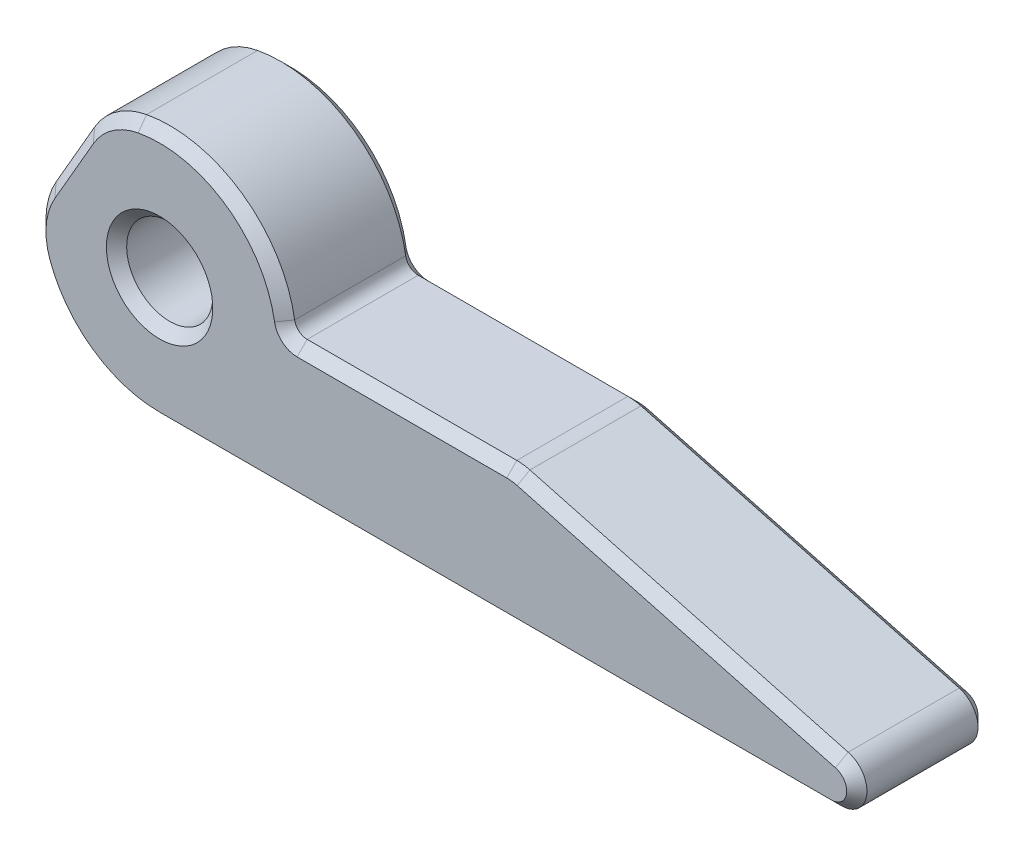
ISO-10303-21;
HEADER;
FILE_DESCRIPTION(('STEP AP214'),'2;1');
FILE_NAME('part.step','',(''),(''),'','','');
FILE_SCHEMA(('AUTOMOTIVE_DESIGN { 1 0 10303 214 1 1 1 1 }'));
ENDSEC;
DATA;
#1=APPLICATION_CONTEXT('core data for automotive mechanical design processes');
#2=APPLICATION_PROTOCOL_DEFINITION('international standard','automotive_design',2000,#1);
#3=PRODUCT_CONTEXT('',#1,'mechanical');
#4=PRODUCT('Part','Part','',(#3));
#5=PRODUCT_RELATED_PRODUCT_CATEGORY('part','',(#4));
#6=PRODUCT_DEFINITION_FORMATION('','',#4);
#7=PRODUCT_DEFINITION_CONTEXT('part definition',#1,'design');
#8=PRODUCT_DEFINITION('design','',#6,#7);
#9=PRODUCT_DEFINITION_SHAPE('','',#8);
#10=(LENGTH_UNIT() NAMED_UNIT(*) SI_UNIT(.MILLI.,.METRE.));
#11=(NAMED_UNIT(*) PLANE_ANGLE_UNIT() SI_UNIT($,.RADIAN.));
#12=(NAMED_UNIT(*) SI_UNIT($,.STERADIAN.) SOLID_ANGLE_UNIT());
#13=UNCERTAINTY_MEASURE_WITH_UNIT(LENGTH_MEASURE(1.E-05),#10,'distance_accuracy_value','');
#14=(GEOMETRIC_REPRESENTATION_CONTEXT(3) GLOBAL_UNCERTAINTY_ASSIGNED_CONTEXT((#13)) GLOBAL_UNIT_ASSIGNED_CONTEXT((#10,
#11,#12)) REPRESENTATION_CONTEXT('',''));
#15=CARTESIAN_POINT('',(0.,0.,0.));
#16=DIRECTION('',(0.,0.,1.));
#17=DIRECTION('',(1.,0.,0.));
#18=AXIS2_PLACEMENT_3D('',#15,#16,#17);
#19=CARTESIAN_POINT('',(0.,-20.6,45.4607145937333));
#20=DIRECTION('',(0.,1.,0.));
#21=DIRECTION('',(-1.,0.,0.));
#22=AXIS2_PLACEMENT_3D('',#19,#20,#21);
#23=PLANE('',#22);
#24=DIRECTION('',(0.,0.,-1.));
#25=VECTOR('',#24,1.);
#26=CARTESIAN_POINT('',(-1.,-20.6,45.4607145937333));
#27=LINE('',#26,#25);
#28=CARTESIAN_POINT('',(-1.,-20.6,11.1433826258471));
#29=VERTEX_POINT('',#28);
#30=CARTESIAN_POINT('',(-1.,-20.6,6.76005707491728));
#31=VERTEX_POINT('',#30);
#32=EDGE_CURVE('E387',#29,#31,#27,.T.);
#33=ORIENTED_EDGE('',*,*,#32,.F.);
#34=DIRECTION('',(-1.,0.,0.));
#35=VECTOR('',#34,1.);
#36=CARTESIAN_POINT('',(0.,-20.6,11.1433826258471));
#37=LINE('',#36,#35);
#38=CARTESIAN_POINT('',(-27.5238826855943,-20.6,11.1433826258471));
#39=VERTEX_POINT('',#38);
#40=EDGE_CURVE('E201',#29,#39,#37,.T.);
#41=ORIENTED_EDGE('',*,*,#40,.T.);
#42=DIRECTION('',(0.,0.,-1.));
#43=VECTOR('',#42,1.);
#44=CARTESIAN_POINT('',(-27.5238826855943,-20.6,45.4607145937333));
#45=LINE('',#44,#43);
#46=CARTESIAN_POINT('',(-27.5238826855943,-20.6,6.76005707491728));
#47=VERTEX_POINT('',#46);
#48=EDGE_CURVE('E318',#39,#47,#45,.T.);
#49=ORIENTED_EDGE('',*,*,#48,.T.);
#50=DIRECTION('',(1.,0.,0.));
#51=VECTOR('',#50,1.);
#52=CARTESIAN_POINT('',(-1.,-20.6,6.76005707491728));
#53=LINE('',#52,#51);
#54=EDGE_CURVE('E223',#47,#31,#53,.T.);
#55=ORIENTED_EDGE('',*,*,#54,.T.);
#56=EDGE_LOOP('',(#33,#41,#49,#55));
#57=FACE_BOUND('',#56,.T.);
#58=ADVANCED_FACE('F43',(#57),#23,.F.);
#59=CARTESIAN_POINT('',(-1.,-19.6,45.4607145937333));
#60=DIRECTION('',(0.,0.,-1.));
#61=DIRECTION('',(-1.,0.,0.));
#62=AXIS2_PLACEMENT_3D('',#59,#60,#61);
#63=CYLINDRICAL_SURFACE('',#62,1.);
#64=DIRECTION('',(0.,0.,-1.));
#65=VECTOR('',#64,1.);
#66=CARTESIAN_POINT('',(-0.741180954897485,-18.6340741737109,45.4607145937333));
#67=LINE('',#66,#65);
#68=CARTESIAN_POINT('',(-0.741180954897485,-18.6340741737109,11.1433826258471));
#69=VERTEX_POINT('',#68);
#70=CARTESIAN_POINT('',(-0.741180954897485,-18.6340741737109,6.76005707491728));
#71=VERTEX_POINT('',#70);
#72=EDGE_CURVE('E443',#69,#71,#67,.T.);
#73=ORIENTED_EDGE('',*,*,#72,.F.);
#74=CARTESIAN_POINT('',(-1.,-19.6,11.1433826258471));
#75=DIRECTION('',(0.,0.,-1.));
#76=DIRECTION('',(-1.,0.,0.));
#77=AXIS2_PLACEMENT_3D('',#74,#75,#76);
#78=CIRCLE('',#77,1.);
#79=EDGE_CURVE('E270',#69,#29,#78,.T.);
#80=ORIENTED_EDGE('',*,*,#79,.T.);
#81=ORIENTED_EDGE('',*,*,#32,.T.);
#82=CARTESIAN_POINT('',(-1.,-19.6,6.76005707491728));
#83=DIRECTION('',(0.,0.,-1.));
#84=DIRECTION('',(-1.,0.,0.));
#85=AXIS2_PLACEMENT_3D('',#82,#83,#84);
#86=CIRCLE('',#85,1.);
#87=EDGE_CURVE('E267',#31,#71,#86,.F.);
#88=ORIENTED_EDGE('',*,*,#87,.T.);
#89=EDGE_LOOP('',(#73,#80,#81,#88));
#90=FACE_BOUND('',#89,.T.);
#91=ADVANCED_FACE('F441',(#90),#63,.T.);
#92=CARTESIAN_POINT('',(-4.70816825300518,-17.5711231307985,45.4607145937333));
#93=DIRECTION('',(-0.258819045102516,-0.96592582628907,0.));
#94=DIRECTION('',(0.96592582628907,-0.258819045102516,0.));
#95=AXIS2_PLACEMENT_3D('',#92,#93,#94);
#96=PLANE('',#95);
#97=DIRECTION('',(0.,0.,-1.));
#98=VECTOR('',#97,1.);
#99=CARTESIAN_POINT('',(-13.3029871531169,-15.2681483474218,45.4607145937333));
#100=LINE('',#99,#98);
#101=CARTESIAN_POINT('',(-13.3029871531169,-15.2681483474218,11.1433826258471));
#102=VERTEX_POINT('',#101);
#103=CARTESIAN_POINT('',(-13.3029871531169,-15.2681483474218,6.76005707491728));
#104=VERTEX_POINT('',#103);
#105=EDGE_CURVE('E445',#102,#104,#100,.T.);
#106=ORIENTED_EDGE('',*,*,#105,.F.);
#107=DIRECTION('',(0.96592582628907,-0.258819045102516,0.));
#108=VECTOR('',#107,1.);
#109=CARTESIAN_POINT('',(-4.70816825300518,-17.5711231307985,11.1433826258471));
#110=LINE('',#109,#108);
#111=EDGE_CURVE('E265',#102,#69,#110,.T.);
#112=ORIENTED_EDGE('',*,*,#111,.T.);
#113=ORIENTED_EDGE('',*,*,#72,.T.);
#114=DIRECTION('',(-0.96592582628907,0.258819045102516,0.));
#115=VECTOR('',#114,1.);
#116=CARTESIAN_POINT('',(-13.3029871531169,-15.2681483474218,6.76005707491728));
#117=LINE('',#116,#115);
#118=EDGE_CURVE('E263',#71,#104,#117,.T.);
#119=ORIENTED_EDGE('',*,*,#118,.T.);
#120=EDGE_LOOP('',(#106,#112,#113,#119));
#121=FACE_BOUND('',#120,.T.);
#122=ADVANCED_FACE('F516',(#121),#96,.F.);
#123=CARTESIAN_POINT('',(-13.8206252433219,-17.2,45.4607145937333));
#124=DIRECTION('',(0.,0.,-1.));
#125=DIRECTION('',(-1.,0.,0.));
#126=AXIS2_PLACEMENT_3D('',#123,#124,#125);
#127=CYLINDRICAL_SURFACE('',#126,2.);
#128=DIRECTION('',(0.,0.,-1.));
#129=VECTOR('',#128,1.);
#130=CARTESIAN_POINT('',(-13.8206252433219,-15.2,45.4607145937333));
#131=LINE('',#130,#129);
#132=CARTESIAN_POINT('',(-13.8206252433219,-15.2,11.1433826258471));
#133=VERTEX_POINT('',#132);
#134=CARTESIAN_POINT('',(-13.8206252433219,-15.2,6.76005707491728));
#135=VERTEX_POINT('',#134);
#136=EDGE_CURVE('E378',#133,#135,#131,.T.);
#137=ORIENTED_EDGE('',*,*,#136,.F.);
#138=CARTESIAN_POINT('',(-13.8206252433219,-17.2,11.1433826258471));
#139=DIRECTION('',(0.,0.,-1.));
#140=DIRECTION('',(-1.,0.,0.));
#141=AXIS2_PLACEMENT_3D('',#138,#139,#140);
#142=CIRCLE('',#141,2.);
#143=EDGE_CURVE('E261',#133,#102,#142,.T.);
#144=ORIENTED_EDGE('',*,*,#143,.T.);
#145=ORIENTED_EDGE('',*,*,#105,.T.);
#146=CARTESIAN_POINT('',(-13.8206252433219,-17.2,6.76005707491728));
#147=DIRECTION('',(0.,0.,-1.));
#148=DIRECTION('',(-1.,0.,0.));
#149=AXIS2_PLACEMENT_3D('',#146,#147,#148);
#150=CIRCLE('',#149,2.);
#151=EDGE_CURVE('E259',#104,#135,#150,.F.);
#152=ORIENTED_EDGE('',*,*,#151,.T.);
#153=EDGE_LOOP('',(#137,#144,#145,#152));
#154=FACE_BOUND('',#153,.T.);
#155=ADVANCED_FACE('F514',(#154),#127,.T.);
#156=CARTESIAN_POINT('',(-3.02407852323237E-13,-15.2000000000003,45.4607145937333));
#157=DIRECTION('',(0.,-1.,0.));
#158=DIRECTION('',(1.,0.,0.));
#159=AXIS2_PLACEMENT_3D('',#156,#157,#158);
#160=PLANE('',#159);
#161=DIRECTION('',(0.,0.,-1.));
#162=VECTOR('',#161,1.);
#163=CARTESIAN_POINT('',(-22.0980186990941,-15.1999999999998,45.4607145937333));
#164=LINE('',#163,#162);
#165=CARTESIAN_POINT('',(-22.0980186990941,-15.1999999999998,6.76005707491728));
#166=VERTEX_POINT('',#165);
#167=CARTESIAN_POINT('',(-22.0980186990941,-15.1999999999998,11.1433826258471));
#168=VERTEX_POINT('',#167);
#169=EDGE_CURVE('E390',#166,#168,#164,.F.);
#170=ORIENTED_EDGE('',*,*,#169,.T.);
#171=DIRECTION('',(1.,0.,0.));
#172=VECTOR('',#171,1.);
#173=CARTESIAN_POINT('',(-3.02407852323237E-13,-15.2000000000003,11.1433826258471));
#174=LINE('',#173,#172);
#175=EDGE_CURVE('E257',#168,#133,#174,.T.);
#176=ORIENTED_EDGE('',*,*,#175,.T.);
#177=ORIENTED_EDGE('',*,*,#136,.T.);
#178=DIRECTION('',(-1.,0.,0.));
#179=VECTOR('',#178,1.);
#180=CARTESIAN_POINT('',(-22.0980186990941,-15.1999999999998,6.76005707491728));
#181=LINE('',#180,#179);
#182=EDGE_CURVE('E255',#135,#166,#181,.T.);
#183=ORIENTED_EDGE('',*,*,#182,.T.);
#184=EDGE_LOOP('',(#170,#176,#177,#183));
#185=FACE_BOUND('',#184,.T.);
#186=ADVANCED_FACE('F453',(#185),#160,.F.);
#187=CARTESIAN_POINT('',(-27.5238826855943,-15.6,45.4607145937333));
#188=DIRECTION('',(0.,0.,-1.));
#189=DIRECTION('',(-1.,0.,0.));
#190=AXIS2_PLACEMENT_3D('',#187,#188,#189);
#191=CYLINDRICAL_SURFACE('',#190,4.99999999999998);
#192=DIRECTION('',(0.,0.,-1.));
#193=VECTOR('',#192,1.);
#194=CARTESIAN_POINT('',(-28.4386297286974,-10.684388354728,45.4607145937333));
#195=LINE('',#194,#193);
#196=CARTESIAN_POINT('',(-28.4386297286974,-10.684388354728,11.1433826258471));
#197=VERTEX_POINT('',#196);
#198=CARTESIAN_POINT('',(-28.4386297286974,-10.684388354728,6.76005707491728));
#199=VERTEX_POINT('',#198);
#200=EDGE_CURVE('E368',#197,#199,#195,.T.);
#201=ORIENTED_EDGE('',*,*,#200,.F.);
#202=CARTESIAN_POINT('',(-27.5238826855943,-15.6,11.1433826258471));
#203=DIRECTION('',(0.,0.,-1.));
#204=DIRECTION('',(-1.,0.,0.));
#205=AXIS2_PLACEMENT_3D('',#202,#203,#204);
#206=CIRCLE('',#205,4.99999999999998);
#207=CARTESIAN_POINT('',(-22.5912790615032,-14.781818181818,11.1433826258471));
#208=VERTEX_POINT('',#207);
#209=EDGE_CURVE('E249',#197,#208,#206,.T.);
#210=ORIENTED_EDGE('',*,*,#209,.T.);
#211=DIRECTION('',(0.,0.,-1.));
#212=VECTOR('',#211,1.);
#213=CARTESIAN_POINT('',(-22.5912790615032,-14.781818181818,45.4607145937333));
#214=LINE('',#213,#212);
#215=CARTESIAN_POINT('',(-22.5912790615032,-14.781818181818,6.76005707491728));
#216=VERTEX_POINT('',#215);
#217=EDGE_CURVE('E384',#208,#216,#214,.T.);
#218=ORIENTED_EDGE('',*,*,#217,.T.);
#219=CARTESIAN_POINT('',(-27.5238826855943,-15.6,6.76005707491728));
#220=DIRECTION('',(0.,0.,-1.));
#221=DIRECTION('',(-1.,0.,0.));
#222=AXIS2_PLACEMENT_3D('',#219,#220,#221);
#223=CIRCLE('',#222,4.99999999999998);
#224=EDGE_CURVE('E247',#216,#199,#223,.F.);
#225=ORIENTED_EDGE('',*,*,#224,.T.);
#226=EDGE_LOOP('',(#201,#210,#218,#225));
#227=FACE_BOUND('',#226,.T.);
#228=ADVANCED_FACE('F489',(#227),#191,.T.);
#229=CARTESIAN_POINT('',(-27.8897815028355,-13.6337553418912,45.4607145937333));
#230=DIRECTION('',(0.,0.,-1.));
#231=DIRECTION('',(-1.,0.,0.));
#232=AXIS2_PLACEMENT_3D('',#229,#230,#231);
#233=CYLINDRICAL_SURFACE('',#232,3.00000000000002);
#234=DIRECTION('',(0.,0.,-1.));
#235=VECTOR('',#234,1.);
#236=CARTESIAN_POINT('',(-30.4878577141889,-12.1337553418912,45.4607145937333));
#237=LINE('',#236,#235);
#238=CARTESIAN_POINT('',(-30.4878577141889,-12.1337553418912,11.1433826258471));
#239=VERTEX_POINT('',#238);
#240=CARTESIAN_POINT('',(-30.4878577141889,-12.1337553418912,6.76005707491728));
#241=VERTEX_POINT('',#240);
#242=EDGE_CURVE('E365',#239,#241,#237,.T.);
#243=ORIENTED_EDGE('',*,*,#242,.F.);
#244=CARTESIAN_POINT('',(-27.8897815028355,-13.6337553418912,11.1433826258471));
#245=DIRECTION('',(0.,0.,-1.));
#246=DIRECTION('',(-1.,0.,0.));
#247=AXIS2_PLACEMENT_3D('',#244,#245,#246);
#248=CIRCLE('',#247,3.00000000000002);
#249=EDGE_CURVE('E245',#239,#197,#248,.T.);
#250=ORIENTED_EDGE('',*,*,#249,.T.);
#251=ORIENTED_EDGE('',*,*,#200,.T.);
#252=CARTESIAN_POINT('',(-27.8897815028355,-13.6337553418912,6.76005707491728));
#253=DIRECTION('',(0.,0.,-1.));
#254=DIRECTION('',(-1.,0.,0.));
#255=AXIS2_PLACEMENT_3D('',#252,#253,#254);
#256=CIRCLE('',#255,3.00000000000002);
#257=EDGE_CURVE('E243',#199,#241,#256,.F.);
#258=ORIENTED_EDGE('',*,*,#257,.T.);
#259=EDGE_LOOP('',(#243,#250,#251,#258));
#260=FACE_BOUND('',#259,.T.);
#261=ADVANCED_FACE('F364',(#260),#233,.T.);
#262=CARTESIAN_POINT('',(-17.6118231009505,10.1681908082536,45.4607145937333));
#263=DIRECTION('',(0.866025403784444,-0.499999999999991,0.));
#264=DIRECTION('',(0.499999999999991,0.866025403784444,0.));
#265=AXIS2_PLACEMENT_3D('',#262,#263,#264);
#266=PLANE('',#265);
#267=DIRECTION('',(0.,0.,-1.));
#268=VECTOR('',#267,1.);
#269=CARTESIAN_POINT('',(-32.0077261295459,-14.7662446581089,45.4607145937333));
#270=LINE('',#269,#268);
#271=CARTESIAN_POINT('',(-32.0077261295459,-14.7662446581089,11.1433826258471));
#272=VERTEX_POINT('',#271);
#273=CARTESIAN_POINT('',(-32.0077261295459,-14.7662446581089,6.76005707491728));
#274=VERTEX_POINT('',#273);
#275=EDGE_CURVE('E374',#272,#274,#270,.T.);
#276=ORIENTED_EDGE('',*,*,#275,.F.);
#277=DIRECTION('',(0.499999999999991,0.866025403784444,0.));
#278=VECTOR('',#277,1.);
#279=CARTESIAN_POINT('',(-17.6118231009505,10.1681908082536,11.1433826258471));
#280=LINE('',#279,#278);
#281=EDGE_CURVE('E241',#272,#239,#280,.T.);
#282=ORIENTED_EDGE('',*,*,#281,.T.);
#283=ORIENTED_EDGE('',*,*,#242,.T.);
#284=DIRECTION('',(-0.499999999999991,-0.866025403784444,0.));
#285=VECTOR('',#284,1.);
#286=CARTESIAN_POINT('',(-32.0077261295459,-14.7662446581089,6.76005707491728));
#287=LINE('',#286,#285);
#288=EDGE_CURVE('E239',#241,#274,#287,.T.);
#289=ORIENTED_EDGE('',*,*,#288,.T.);
#290=EDGE_LOOP('',(#276,#282,#283,#289));
#291=FACE_BOUND('',#290,.T.);
#292=ADVANCED_FACE('F371',(#291),#266,.F.);
#293=CARTESIAN_POINT('',(-29.4096499181926,-16.2662446581088,45.4607145937333));
#294=DIRECTION('',(0.,0.,-1.));
#295=DIRECTION('',(-1.,0.,0.));
#296=AXIS2_PLACEMENT_3D('',#293,#294,#295);
#297=CYLINDRICAL_SURFACE('',#296,3.);
#298=DIRECTION('',(0.,0.,-1.));
#299=VECTOR('',#298,1.);
#300=CARTESIAN_POINT('',(-32.23830076709,-17.2656116452721,45.4607145937333));
#301=LINE('',#300,#299);
#302=CARTESIAN_POINT('',(-32.23830076709,-17.2656116452721,11.1433826258471));
#303=VERTEX_POINT('',#302);
#304=CARTESIAN_POINT('',(-32.23830076709,-17.2656116452721,6.76005707491728));
#305=VERTEX_POINT('',#304);
#306=EDGE_CURVE('E376',#303,#305,#301,.T.);
#307=ORIENTED_EDGE('',*,*,#306,.F.);
#308=CARTESIAN_POINT('',(-29.4096499181926,-16.2662446581088,11.1433826258471));
#309=DIRECTION('',(0.,0.,-1.));
#310=DIRECTION('',(-1.,0.,0.));
#311=AXIS2_PLACEMENT_3D('',#308,#309,#310);
#312=CIRCLE('',#311,3.);
#313=EDGE_CURVE('E237',#303,#272,#312,.T.);
#314=ORIENTED_EDGE('',*,*,#313,.T.);
#315=ORIENTED_EDGE('',*,*,#275,.T.);
#316=CARTESIAN_POINT('',(-29.4096499181926,-16.2662446581088,6.76005707491728));
#317=DIRECTION('',(0.,0.,-1.));
#318=DIRECTION('',(-1.,0.,0.));
#319=AXIS2_PLACEMENT_3D('',#316,#317,#318);
#320=CIRCLE('',#319,3.);
#321=EDGE_CURVE('E235',#274,#305,#320,.F.);
#322=ORIENTED_EDGE('',*,*,#321,.T.);
#323=EDGE_LOOP('',(#307,#314,#315,#322));
#324=FACE_BOUND('',#323,.T.);
#325=ADVANCED_FACE('F768',(#324),#297,.T.);
#326=CARTESIAN_POINT('',(-27.5238826855943,-15.6,45.4607145937333));
#327=DIRECTION('',(0.,0.,-1.));
#328=DIRECTION('',(-1.,0.,0.));
#329=AXIS2_PLACEMENT_3D('',#326,#327,#328);
#330=CYLINDRICAL_SURFACE('',#329,1.70000000000002);
#331=CARTESIAN_POINT('',(-27.5238826855943,-15.6,11.1433826258471));
#332=DIRECTION('',(0.,0.,-1.));
#333=DIRECTION('',(-1.,0.,0.));
#334=AXIS2_PLACEMENT_3D('',#331,#332,#333);
#335=CIRCLE('',#334,1.70000000000002);
#336=CARTESIAN_POINT('',(-29.2238826855943,-15.6,11.1433826258471));
#337=VERTEX_POINT('',#336);
#338=EDGE_CURVE('E215',#337,#337,#335,.F.);
#339=ORIENTED_EDGE('',*,*,#338,.T.);
#340=EDGE_LOOP('',(#339));
#341=FACE_BOUND('',#340,.T.);
#342=CARTESIAN_POINT('',(-27.5238826855943,-15.6,6.76005707491728));
#343=DIRECTION('',(0.,0.,-1.));
#344=DIRECTION('',(-1.,0.,0.));
#345=AXIS2_PLACEMENT_3D('',#342,#343,#344);
#346=CIRCLE('',#345,1.70000000000002);
#347=CARTESIAN_POINT('',(-29.2238826855943,-15.6,6.76005707491728));
#348=VERTEX_POINT('',#347);
#349=EDGE_CURVE('E393',#348,#348,#346,.T.);
#350=ORIENTED_EDGE('',*,*,#349,.T.);
#351=EDGE_LOOP('',(#350));
#352=FACE_BOUND('',#351,.T.);
#353=ADVANCED_FACE('F759',(#341,#352),#330,.F.);
#354=ORIENTED_EDGE('',*,*,#48,.F.);
#355=CARTESIAN_POINT('',(-27.5238826855943,-15.6,11.1433826258471));
#356=DIRECTION('',(0.,0.,-1.));
#357=DIRECTION('',(-1.,0.,0.));
#358=AXIS2_PLACEMENT_3D('',#355,#356,#357);
#359=CIRCLE('',#358,4.99999999999998);
#360=EDGE_CURVE('E233',#39,#303,#359,.T.);
#361=ORIENTED_EDGE('',*,*,#360,.T.);
#362=ORIENTED_EDGE('',*,*,#306,.T.);
#363=CARTESIAN_POINT('',(-27.5238826855943,-15.6,6.76005707491728));
#364=DIRECTION('',(0.,0.,-1.));
#365=DIRECTION('',(-1.,0.,0.));
#366=AXIS2_PLACEMENT_3D('',#363,#364,#365);
#367=CIRCLE('',#366,4.99999999999998);
#368=EDGE_CURVE('E231',#305,#47,#367,.F.);
#369=ORIENTED_EDGE('',*,*,#368,.T.);
#370=EDGE_LOOP('',(#354,#361,#362,#369));
#371=FACE_BOUND('',#370,.T.);
#372=ADVANCED_FACE('F427',(#371),#191,.T.);
#373=CARTESIAN_POINT('',(0.,0.,6.36005707491728));
#374=DIRECTION('',(0.,0.,-1.));
#375=DIRECTION('',(-1.,0.,0.));
#376=AXIS2_PLACEMENT_3D('',#373,#374,#375);
#377=PLANE('',#376);
#378=DIRECTION('',(0.96592582628907,-0.258819045102516,0.));
#379=VECTOR('',#378,1.);
#380=CARTESIAN_POINT('',(-0.844708572938492,-19.0204445042266,6.36005707491728));
#381=LINE('',#380,#379);
#382=CARTESIAN_POINT('',(-13.4065147711579,-15.6545186779375,6.36005707491728));
#383=VERTEX_POINT('',#382);
#384=CARTESIAN_POINT('',(-0.844708572938491,-19.0204445042266,6.36005707491728));
#385=VERTEX_POINT('',#384);
#386=EDGE_CURVE('E53',#383,#385,#381,.T.);
#387=ORIENTED_EDGE('',*,*,#386,.T.);
#388=CARTESIAN_POINT('',(-1.,-19.6,6.36005707491728));
#389=DIRECTION('',(0.,0.,-1.));
#390=DIRECTION('',(-1.,0.,0.));
#391=AXIS2_PLACEMENT_3D('',#388,#389,#390);
#392=CIRCLE('',#391,0.6);
#393=CARTESIAN_POINT('',(-1.,-20.2,6.36005707491728));
#394=VERTEX_POINT('',#393);
#395=EDGE_CURVE('E11',#385,#394,#392,.T.);
#396=ORIENTED_EDGE('',*,*,#395,.T.);
#397=DIRECTION('',(-1.,0.,0.));
#398=VECTOR('',#397,1.);
#399=CARTESIAN_POINT('',(-27.5238826855943,-20.2,6.36005707491728));
#400=LINE('',#399,#398);
#401=CARTESIAN_POINT('',(-27.5238826855943,-20.2,6.36005707491728));
#402=VERTEX_POINT('',#401);
#403=EDGE_CURVE('E275',#394,#402,#400,.T.);
#404=ORIENTED_EDGE('',*,*,#403,.T.);
#405=CARTESIAN_POINT('',(-27.5238826855943,-15.6,6.36005707491728));
#406=DIRECTION('',(0.,0.,-1.));
#407=DIRECTION('',(-1.,0.,0.));
#408=AXIS2_PLACEMENT_3D('',#405,#406,#407);
#409=CIRCLE('',#408,4.59999999999997);
#410=CARTESIAN_POINT('',(-31.8611473205703,-17.1323627136504,6.36005707491728));
#411=VERTEX_POINT('',#410);
#412=EDGE_CURVE('E277',#402,#411,#409,.T.);
#413=ORIENTED_EDGE('',*,*,#412,.T.);
#414=CARTESIAN_POINT('',(-29.4096499181926,-16.2662446581088,6.36005707491728));
#415=DIRECTION('',(0.,0.,-1.));
#416=DIRECTION('',(-1.,0.,0.));
#417=AXIS2_PLACEMENT_3D('',#414,#415,#416);
#418=CIRCLE('',#417,2.6);
#419=CARTESIAN_POINT('',(-31.6613159680321,-14.9662446581089,6.36005707491728));
#420=VERTEX_POINT('',#419);
#421=EDGE_CURVE('E279',#411,#420,#418,.T.);
#422=ORIENTED_EDGE('',*,*,#421,.T.);
#423=DIRECTION('',(0.499999999999991,0.866025403784444,0.));
#424=VECTOR('',#423,1.);
#425=CARTESIAN_POINT('',(-30.1414475526751,-12.3337553418912,6.36005707491728));
#426=LINE('',#425,#424);
#427=CARTESIAN_POINT('',(-30.1414475526751,-12.3337553418912,6.36005707491728));
#428=VERTEX_POINT('',#427);
#429=EDGE_CURVE('E281',#420,#428,#426,.T.);
#430=ORIENTED_EDGE('',*,*,#429,.T.);
#431=CARTESIAN_POINT('',(-27.8897815028355,-13.6337553418912,6.36005707491728));
#432=DIRECTION('',(0.,0.,-1.));
#433=DIRECTION('',(-1.,0.,0.));
#434=AXIS2_PLACEMENT_3D('',#431,#432,#433);
#435=CIRCLE('',#434,2.60000000000002);
#436=CARTESIAN_POINT('',(-28.3654499652491,-11.0776372863497,6.36005707491728));
#437=VERTEX_POINT('',#436);
#438=EDGE_CURVE('E283',#428,#437,#435,.T.);
#439=ORIENTED_EDGE('',*,*,#438,.T.);
#440=CARTESIAN_POINT('',(-27.5238826855943,-15.6,6.36005707491728));
#441=DIRECTION('',(0.,0.,-1.));
#442=DIRECTION('',(-1.,0.,0.));
#443=AXIS2_PLACEMENT_3D('',#440,#441,#442);
#444=CIRCLE('',#443,4.59999999999997);
#445=CARTESIAN_POINT('',(-22.9858873514305,-14.8472727272726,6.36005707491728));
#446=VERTEX_POINT('',#445);
#447=EDGE_CURVE('E285',#437,#446,#444,.T.);
#448=ORIENTED_EDGE('',*,*,#447,.T.);
#449=CARTESIAN_POINT('',(-22.0980186990941,-14.6999999999998,6.36005707491728));
#450=DIRECTION('',(0.,0.,-1.));
#451=DIRECTION('',(-1.,0.,0.));
#452=AXIS2_PLACEMENT_3D('',#449,#450,#451);
#453=CIRCLE('',#452,0.900000000000003);
#454=CARTESIAN_POINT('',(-22.0980186990941,-15.5999999999998,6.36005707491728));
#455=VERTEX_POINT('',#454);
#456=EDGE_CURVE('E287',#446,#455,#453,.F.);
#457=ORIENTED_EDGE('',*,*,#456,.T.);
#458=DIRECTION('',(1.,0.,0.));
#459=VECTOR('',#458,1.);
#460=CARTESIAN_POINT('',(-13.8206252433219,-15.6,6.36005707491728));
#461=LINE('',#460,#459);
#462=CARTESIAN_POINT('',(-13.8206252433219,-15.6,6.36005707491728));
#463=VERTEX_POINT('',#462);
#464=EDGE_CURVE('E289',#455,#463,#461,.T.);
#465=ORIENTED_EDGE('',*,*,#464,.T.);
#466=CARTESIAN_POINT('',(-13.8206252433219,-17.2,6.36005707491728));
#467=DIRECTION('',(0.,0.,-1.));
#468=DIRECTION('',(-1.,0.,0.));
#469=AXIS2_PLACEMENT_3D('',#466,#467,#468);
#470=CIRCLE('',#469,1.59999999999999);
#471=EDGE_CURVE('E64',#463,#383,#470,.T.);
#472=ORIENTED_EDGE('',*,*,#471,.T.);
#473=EDGE_LOOP('',(#387,#396,#404,#413,#422,#430,#439,#448,#457,#465,#472));
#474=FACE_BOUND('',#473,.T.);
#475=CARTESIAN_POINT('',(-27.5238826855943,-15.6,6.36005707491728));
#476=DIRECTION('',(0.,0.,-1.));
#477=DIRECTION('',(-1.,0.,0.));
#478=AXIS2_PLACEMENT_3D('',#475,#476,#477);
#479=CIRCLE('',#478,2.10000000000002);
#480=CARTESIAN_POINT('',(-29.6238826855943,-15.6,6.36005707491728));
#481=VERTEX_POINT('',#480);
#482=EDGE_CURVE('E272',#481,#481,#479,.F.);
#483=ORIENTED_EDGE('',*,*,#482,.T.);
#484=EDGE_LOOP('',(#483));
#485=FACE_BOUND('',#484,.T.);
#486=ADVANCED_FACE('F472',(#474,#485),#377,.T.);
#487=CARTESIAN_POINT('',(0.,0.,11.5433826258471));
#488=DIRECTION('',(0.,0.,-1.));
#489=DIRECTION('',(-1.,0.,0.));
#490=AXIS2_PLACEMENT_3D('',#487,#488,#489);
#491=PLANE('',#490);
#492=CARTESIAN_POINT('',(-27.5238826855943,-15.6,11.5433826258471));
#493=DIRECTION('',(0.,0.,-1.));
#494=DIRECTION('',(-1.,0.,0.));
#495=AXIS2_PLACEMENT_3D('',#492,#493,#494);
#496=CIRCLE('',#495,2.10000000000003);
#497=CARTESIAN_POINT('',(-29.6238826855943,-15.6,11.5433826258471));
#498=VERTEX_POINT('',#497);
#499=EDGE_CURVE('E220',#498,#498,#496,.T.);
#500=ORIENTED_EDGE('',*,*,#499,.T.);
#501=EDGE_LOOP('',(#500));
#502=FACE_BOUND('',#501,.T.);
#503=CARTESIAN_POINT('',(-27.5238826855943,-15.6,11.5433826258471));
#504=DIRECTION('',(0.,0.,-1.));
#505=DIRECTION('',(-1.,0.,0.));
#506=AXIS2_PLACEMENT_3D('',#503,#504,#505);
#507=CIRCLE('',#506,4.59999999999998);
#508=CARTESIAN_POINT('',(-31.8611473205703,-17.1323627136504,11.5433826258471));
#509=VERTEX_POINT('',#508);
#510=CARTESIAN_POINT('',(-27.5238826855943,-20.1999999999999,11.5433826258471));
#511=VERTEX_POINT('',#510);
#512=EDGE_CURVE('E219',#509,#511,#507,.F.);
#513=ORIENTED_EDGE('',*,*,#512,.T.);
#514=DIRECTION('',(1.,0.,0.));
#515=VECTOR('',#514,1.);
#516=CARTESIAN_POINT('',(0.,-20.2,11.5433826258471));
#517=LINE('',#516,#515);
#518=CARTESIAN_POINT('',(-1.,-20.2,11.5433826258471));
#519=VERTEX_POINT('',#518);
#520=EDGE_CURVE('E198',#511,#519,#517,.T.);
#521=ORIENTED_EDGE('',*,*,#520,.T.);
#522=CARTESIAN_POINT('',(-1.,-19.6,11.5433826258471));
#523=DIRECTION('',(0.,0.,-1.));
#524=DIRECTION('',(-1.,0.,0.));
#525=AXIS2_PLACEMENT_3D('',#522,#523,#524);
#526=CIRCLE('',#525,0.600000000000007);
#527=CARTESIAN_POINT('',(-0.84470857293849,-19.0204445042266,11.5433826258471));
#528=VERTEX_POINT('',#527);
#529=EDGE_CURVE('E208',#519,#528,#526,.F.);
#530=ORIENTED_EDGE('',*,*,#529,.T.);
#531=DIRECTION('',(-0.96592582628907,0.258819045102516,0.));
#532=VECTOR('',#531,1.);
#533=CARTESIAN_POINT('',(-4.81169587104618,-17.9574934613141,11.5433826258471));
#534=LINE('',#533,#532);
#535=CARTESIAN_POINT('',(-13.4065147711579,-15.6545186779375,11.5433826258471));
#536=VERTEX_POINT('',#535);
#537=EDGE_CURVE('E214',#528,#536,#534,.T.);
#538=ORIENTED_EDGE('',*,*,#537,.T.);
#539=CARTESIAN_POINT('',(-13.8206252433219,-17.2,11.5433826258471));
#540=DIRECTION('',(0.,0.,-1.));
#541=DIRECTION('',(-1.,0.,0.));
#542=AXIS2_PLACEMENT_3D('',#539,#540,#541);
#543=CIRCLE('',#542,1.6);
#544=CARTESIAN_POINT('',(-13.8206252433219,-15.6,11.5433826258471));
#545=VERTEX_POINT('',#544);
#546=EDGE_CURVE('E399',#536,#545,#543,.F.);
#547=ORIENTED_EDGE('',*,*,#546,.T.);
#548=DIRECTION('',(-1.,0.,0.));
#549=VECTOR('',#548,1.);
#550=CARTESIAN_POINT('',(-3.10365953700164E-13,-15.6000000000003,11.5433826258471));
#551=LINE('',#550,#549);
#552=CARTESIAN_POINT('',(-22.0980186990941,-15.5999999999998,11.5433826258471));
#553=VERTEX_POINT('',#552);
#554=EDGE_CURVE('E401',#545,#553,#551,.T.);
#555=ORIENTED_EDGE('',*,*,#554,.T.);
#556=CARTESIAN_POINT('',(-22.0980186990941,-14.6999999999998,11.5433826258471));
#557=DIRECTION('',(0.,0.,-1.));
#558=DIRECTION('',(-1.,0.,0.));
#559=AXIS2_PLACEMENT_3D('',#556,#557,#558);
#560=CIRCLE('',#559,0.899999999999995);
#561=CARTESIAN_POINT('',(-22.9858873514305,-14.8472727272726,11.5433826258471));
#562=VERTEX_POINT('',#561);
#563=EDGE_CURVE('E403',#553,#562,#560,.T.);
#564=ORIENTED_EDGE('',*,*,#563,.T.);
#565=CARTESIAN_POINT('',(-27.5238826855943,-15.6,11.5433826258471));
#566=DIRECTION('',(0.,0.,-1.));
#567=DIRECTION('',(-1.,0.,0.));
#568=AXIS2_PLACEMENT_3D('',#565,#566,#567);
#569=CIRCLE('',#568,4.59999999999998);
#570=CARTESIAN_POINT('',(-28.3654499652491,-11.0776372863497,11.5433826258471));
#571=VERTEX_POINT('',#570);
#572=EDGE_CURVE('E405',#562,#571,#569,.F.);
#573=ORIENTED_EDGE('',*,*,#572,.T.);
#574=CARTESIAN_POINT('',(-27.8897815028355,-13.6337553418912,11.5433826258471));
#575=DIRECTION('',(0.,0.,-1.));
#576=DIRECTION('',(-1.,0.,0.));
#577=AXIS2_PLACEMENT_3D('',#574,#575,#576);
#578=CIRCLE('',#577,2.60000000000002);
#579=CARTESIAN_POINT('',(-30.1414475526751,-12.3337553418912,11.5433826258471));
#580=VERTEX_POINT('',#579);
#581=EDGE_CURVE('E407',#571,#580,#578,.F.);
#582=ORIENTED_EDGE('',*,*,#581,.T.);
#583=DIRECTION('',(-0.499999999999991,-0.866025403784444,0.));
#584=VECTOR('',#583,1.);
#585=CARTESIAN_POINT('',(-17.2654129394367,9.96819080825362,11.5433826258471));
#586=LINE('',#585,#584);
#587=CARTESIAN_POINT('',(-31.6613159680321,-14.9662446581089,11.5433826258471));
#588=VERTEX_POINT('',#587);
#589=EDGE_CURVE('E409',#580,#588,#586,.T.);
#590=ORIENTED_EDGE('',*,*,#589,.T.);
#591=CARTESIAN_POINT('',(-29.4096499181926,-16.2662446581088,11.5433826258471));
#592=DIRECTION('',(0.,0.,-1.));
#593=DIRECTION('',(-1.,0.,0.));
#594=AXIS2_PLACEMENT_3D('',#591,#592,#593);
#595=CIRCLE('',#594,2.60000000000001);
#596=EDGE_CURVE('E225',#588,#509,#595,.F.);
#597=ORIENTED_EDGE('',*,*,#596,.T.);
#598=EDGE_LOOP('',(#513,#521,#530,#538,#547,#555,#564,#573,#582,#590,#597));
#599=FACE_BOUND('',#598,.T.);
#600=ADVANCED_FACE('F217',(#502,#599),#491,.F.);
#601=CARTESIAN_POINT('',(-22.0980186990941,-14.6999999999998,45.4607145937333));
#602=DIRECTION('',(0.,0.,-1.));
#603=DIRECTION('',(-1.,0.,0.));
#604=AXIS2_PLACEMENT_3D('',#601,#602,#603);
#605=CYLINDRICAL_SURFACE('',#604,0.5);
#606=ORIENTED_EDGE('',*,*,#217,.F.);
#607=CARTESIAN_POINT('',(-22.0980186990941,-14.6999999999998,11.1433826258471));
#608=DIRECTION('',(0.,0.,-1.));
#609=DIRECTION('',(-1.,0.,0.));
#610=AXIS2_PLACEMENT_3D('',#607,#608,#609);
#611=CIRCLE('',#610,0.5);
#612=EDGE_CURVE('E253',#208,#168,#611,.F.);
#613=ORIENTED_EDGE('',*,*,#612,.T.);
#614=ORIENTED_EDGE('',*,*,#169,.F.);
#615=CARTESIAN_POINT('',(-22.0980186990941,-14.6999999999998,6.76005707491728));
#616=DIRECTION('',(0.,0.,-1.));
#617=DIRECTION('',(-1.,0.,0.));
#618=AXIS2_PLACEMENT_3D('',#615,#616,#617);
#619=CIRCLE('',#618,0.5);
#620=EDGE_CURVE('E251',#166,#216,#619,.T.);
#621=ORIENTED_EDGE('',*,*,#620,.T.);
#622=EDGE_LOOP('',(#606,#613,#614,#621));
#623=FACE_BOUND('',#622,.T.);
#624=ADVANCED_FACE('F486',(#623),#605,.F.);
#625=CARTESIAN_POINT('',(-27.5238826855943,-15.6,11.1433826258471));
#626=DIRECTION('',(0.,0.,1.));
#627=DIRECTION('',(1.,0.,0.));
#628=AXIS2_PLACEMENT_3D('',#625,#626,#627);
#629=CONICAL_SURFACE('',#628,1.70000000000002,0.78539816339746);
#630=ORIENTED_EDGE('',*,*,#499,.F.);
#631=EDGE_LOOP('',(#630));
#632=FACE_BOUND('',#631,.T.);
#633=ORIENTED_EDGE('',*,*,#338,.F.);
#634=EDGE_LOOP('',(#633));
#635=FACE_BOUND('',#634,.T.);
#636=ADVANCED_FACE('F545',(#632,#635),#629,.F.);
#637=CARTESIAN_POINT('',(-22.0980186990941,-14.6999999999998,11.5433826258471));
#638=DIRECTION('',(0.,0.,1.));
#639=DIRECTION('',(1.,0.,0.));
#640=AXIS2_PLACEMENT_3D('',#637,#638,#639);
#641=CONICAL_SURFACE('',#640,0.899999999999995,0.785398163397453);
#642=DIRECTION('',(0.,-0.707106781186549,0.707106781186546));
#643=VECTOR('',#642,1.);
#644=CARTESIAN_POINT('',(-22.0980186990941,-15.1999999999998,11.1433826258471));
#645=LINE('',#644,#643);
#646=EDGE_CURVE('E312',#168,#553,#645,.T.);
#647=ORIENTED_EDGE('',*,*,#646,.F.);
#648=ORIENTED_EDGE('',*,*,#612,.F.);
#649=DIRECTION('',(0.697575494300031,0.115708382376001,-0.707106781186545));
#650=VECTOR('',#649,1.);
#651=CARTESIAN_POINT('',(-22.9858873514305,-14.8472727272726,11.5433826258471));
#652=LINE('',#651,#650);
#653=EDGE_CURVE('E315',#562,#208,#652,.T.);
#654=ORIENTED_EDGE('',*,*,#653,.F.);
#655=ORIENTED_EDGE('',*,*,#563,.F.);
#656=EDGE_LOOP('',(#647,#648,#654,#655));
#657=FACE_BOUND('',#656,.T.);
#658=ADVANCED_FACE('F504',(#657),#641,.F.);
#659=CARTESIAN_POINT('',(-27.5238826855943,-15.6,11.5433826258471));
#660=DIRECTION('',(0.,0.,-1.));
#661=DIRECTION('',(-1.,0.,0.));
#662=AXIS2_PLACEMENT_3D('',#659,#660,#661);
#663=CONICAL_SURFACE('',#662,4.59999999999998,0.785398163397454);
#664=ORIENTED_EDGE('',*,*,#653,.T.);
#665=ORIENTED_EDGE('',*,*,#209,.F.);
#666=DIRECTION('',(-0.129364767449712,0.695172465610289,-0.707106781186543));
#667=VECTOR('',#666,1.);
#668=CARTESIAN_POINT('',(-28.3654499652491,-11.0776372863497,11.5433826258471));
#669=LINE('',#668,#667);
#670=EDGE_CURVE('E309',#571,#197,#669,.T.);
#671=ORIENTED_EDGE('',*,*,#670,.F.);
#672=ORIENTED_EDGE('',*,*,#572,.F.);
#673=EDGE_LOOP('',(#664,#665,#671,#672));
#674=FACE_BOUND('',#673,.T.);
#675=ADVANCED_FACE('F493',(#674),#663,.T.);
#676=CARTESIAN_POINT('',(-3.02407852323237E-13,-15.2000000000003,11.1433826258471));
#677=DIRECTION('',(0.,-0.707106781186546,-0.707106781186549));
#678=DIRECTION('',(1.,0.,0.));
#679=AXIS2_PLACEMENT_3D('',#676,#677,#678);
#680=PLANE('',#679);
#681=ORIENTED_EDGE('',*,*,#646,.T.);
#682=ORIENTED_EDGE('',*,*,#554,.F.);
#683=DIRECTION('',(0.,-0.707106781186551,0.707106781186544));
#684=VECTOR('',#683,1.);
#685=CARTESIAN_POINT('',(-13.8206252433219,-15.2,11.1433826258471));
#686=LINE('',#685,#684);
#687=EDGE_CURVE('E306',#133,#545,#686,.T.);
#688=ORIENTED_EDGE('',*,*,#687,.F.);
#689=ORIENTED_EDGE('',*,*,#175,.F.);
#690=EDGE_LOOP('',(#681,#682,#688,#689));
#691=FACE_BOUND('',#690,.T.);
#692=ADVANCED_FACE('F506',(#691),#680,.F.);
#693=CARTESIAN_POINT('',(-27.8897815028355,-13.6337553418912,11.5433826258471));
#694=DIRECTION('',(0.,0.,-1.));
#695=DIRECTION('',(-1.,0.,0.));
#696=AXIS2_PLACEMENT_3D('',#693,#694,#695);
#697=CONICAL_SURFACE('',#696,2.60000000000003,0.785398163397455);
#698=ORIENTED_EDGE('',*,*,#670,.T.);
#699=ORIENTED_EDGE('',*,*,#249,.F.);
#700=DIRECTION('',(-0.612372435695804,0.353553390593267,-0.707106781186543));
#701=VECTOR('',#700,1.);
#702=CARTESIAN_POINT('',(-30.1414475526751,-12.3337553418912,11.5433826258471));
#703=LINE('',#702,#701);
#704=EDGE_CURVE('E303',#580,#239,#703,.T.);
#705=ORIENTED_EDGE('',*,*,#704,.F.);
#706=ORIENTED_EDGE('',*,*,#581,.F.);
#707=EDGE_LOOP('',(#698,#699,#705,#706));
#708=FACE_BOUND('',#707,.T.);
#709=ADVANCED_FACE('F498',(#708),#697,.T.);
#710=CARTESIAN_POINT('',(-13.8206252433219,-17.2,11.1433826258471));
#711=DIRECTION('',(0.,0.,-1.));
#712=DIRECTION('',(-1.,0.,0.));
#713=AXIS2_PLACEMENT_3D('',#710,#711,#712);
#714=CONICAL_SURFACE('',#713,2.,0.785398163397453);
#715=ORIENTED_EDGE('',*,*,#687,.T.);
#716=ORIENTED_EDGE('',*,*,#546,.F.);
#717=DIRECTION('',(-0.183012701892215,-0.683012701892224,0.707106781186544));
#718=VECTOR('',#717,1.);
#719=CARTESIAN_POINT('',(-13.3029871531169,-15.2681483474218,11.1433826258471));
#720=LINE('',#719,#718);
#721=EDGE_CURVE('E300',#102,#536,#720,.T.);
#722=ORIENTED_EDGE('',*,*,#721,.F.);
#723=ORIENTED_EDGE('',*,*,#143,.F.);
#724=EDGE_LOOP('',(#715,#716,#722,#723));
#725=FACE_BOUND('',#724,.T.);
#726=ADVANCED_FACE('F511',(#725),#714,.T.);
#727=CARTESIAN_POINT('',(-17.6118231009505,10.1681908082536,11.1433826258471));
#728=DIRECTION('',(0.612372435695799,-0.353553390593268,-0.707106781186546));
#729=DIRECTION('',(0.499999999999991,0.866025403784444,0.));
#730=AXIS2_PLACEMENT_3D('',#727,#728,#729);
#731=PLANE('',#730);
#732=ORIENTED_EDGE('',*,*,#704,.T.);
#733=ORIENTED_EDGE('',*,*,#281,.F.);
#734=DIRECTION('',(-0.612372435695801,0.353553390593266,-0.707106781186546));
#735=VECTOR('',#734,1.);
#736=CARTESIAN_POINT('',(-31.6613159680321,-14.9662446581089,11.5433826258471));
#737=LINE('',#736,#735);
#738=EDGE_CURVE('E297',#588,#272,#737,.T.);
#739=ORIENTED_EDGE('',*,*,#738,.F.);
#740=ORIENTED_EDGE('',*,*,#589,.F.);
#741=EDGE_LOOP('',(#732,#733,#739,#740));
#742=FACE_BOUND('',#741,.T.);
#743=ADVANCED_FACE('F520',(#742),#731,.F.);
#744=CARTESIAN_POINT('',(-4.70816825300518,-17.5711231307985,11.1433826258471));
#745=DIRECTION('',(-0.183012701892215,-0.683012701892219,-0.707106781186549));
#746=DIRECTION('',(0.96592582628907,-0.258819045102516,0.));
#747=AXIS2_PLACEMENT_3D('',#744,#745,#746);
#748=PLANE('',#747);
#749=ORIENTED_EDGE('',*,*,#721,.T.);
#750=ORIENTED_EDGE('',*,*,#537,.F.);
#751=DIRECTION('',(-0.183012701892216,-0.683012701892222,0.707106781186546));
#752=VECTOR('',#751,1.);
#753=CARTESIAN_POINT('',(-0.741180954897485,-18.6340741737109,11.1433826258471));
#754=LINE('',#753,#752);
#755=EDGE_CURVE('E211',#69,#528,#754,.T.);
#756=ORIENTED_EDGE('',*,*,#755,.F.);
#757=ORIENTED_EDGE('',*,*,#111,.F.);
#758=EDGE_LOOP('',(#749,#750,#756,#757));
#759=FACE_BOUND('',#758,.T.);
#760=ADVANCED_FACE('F518',(#759),#748,.F.);
#761=CARTESIAN_POINT('',(-29.4096499181926,-16.2662446581088,11.1433826258471));
#762=DIRECTION('',(0.,0.,-1.));
#763=DIRECTION('',(-1.,0.,0.));
#764=AXIS2_PLACEMENT_3D('',#761,#762,#763);
#765=CONICAL_SURFACE('',#764,3.,0.785398163397451);
#766=ORIENTED_EDGE('',*,*,#738,.T.);
#767=ORIENTED_EDGE('',*,*,#313,.F.);
#768=DIRECTION('',(-0.666719398954821,-0.235553057839047,-0.707106781186545));
#769=VECTOR('',#768,1.);
#770=CARTESIAN_POINT('',(-31.8611473205703,-17.1323627136504,11.5433826258471));
#771=LINE('',#770,#769);
#772=EDGE_CURVE('E204',#509,#303,#771,.T.);
#773=ORIENTED_EDGE('',*,*,#772,.F.);
#774=ORIENTED_EDGE('',*,*,#596,.F.);
#775=EDGE_LOOP('',(#766,#767,#773,#774));
#776=FACE_BOUND('',#775,.T.);
#777=ADVANCED_FACE('F416',(#776),#765,.T.);
#778=CARTESIAN_POINT('',(-1.,-19.6,11.1433826258471));
#779=DIRECTION('',(0.,0.,-1.));
#780=DIRECTION('',(-1.,0.,0.));
#781=AXIS2_PLACEMENT_3D('',#778,#779,#780);
#782=CONICAL_SURFACE('',#781,1.,0.785398163397452);
#783=ORIENTED_EDGE('',*,*,#755,.T.);
#784=ORIENTED_EDGE('',*,*,#529,.F.);
#785=DIRECTION('',(0.,0.707106781186549,0.707106781186546));
#786=VECTOR('',#785,1.);
#787=CARTESIAN_POINT('',(-1.,-20.6,11.1433826258471));
#788=LINE('',#787,#786);
#789=EDGE_CURVE('E194',#29,#519,#788,.T.);
#790=ORIENTED_EDGE('',*,*,#789,.F.);
#791=ORIENTED_EDGE('',*,*,#79,.F.);
#792=EDGE_LOOP('',(#783,#784,#790,#791));
#793=FACE_BOUND('',#792,.T.);
#794=ADVANCED_FACE('F209',(#793),#782,.T.);
#795=CARTESIAN_POINT('',(-27.5238826855943,-15.6,11.5433826258471));
#796=DIRECTION('',(0.,0.,-1.));
#797=DIRECTION('',(-1.,0.,0.));
#798=AXIS2_PLACEMENT_3D('',#795,#796,#797);
#799=CONICAL_SURFACE('',#798,4.59999999999998,0.785398163397455);
#800=ORIENTED_EDGE('',*,*,#772,.T.);
#801=ORIENTED_EDGE('',*,*,#360,.F.);
#802=DIRECTION('',(0.,-0.707106781186555,-0.70710678118654));
#803=VECTOR('',#802,1.);
#804=CARTESIAN_POINT('',(-27.5238826855943,-20.1999999999999,11.5433826258471));
#805=LINE('',#804,#803);
#806=EDGE_CURVE('E205',#511,#39,#805,.T.);
#807=ORIENTED_EDGE('',*,*,#806,.F.);
#808=ORIENTED_EDGE('',*,*,#512,.F.);
#809=EDGE_LOOP('',(#800,#801,#807,#808));
#810=FACE_BOUND('',#809,.T.);
#811=ADVANCED_FACE('F419',(#810),#799,.T.);
#812=CARTESIAN_POINT('',(0.,-20.6,11.1433826258471));
#813=DIRECTION('',(0.,0.707106781186546,-0.707106781186549));
#814=DIRECTION('',(-1.,0.,0.));
#815=AXIS2_PLACEMENT_3D('',#812,#813,#814);
#816=PLANE('',#815);
#817=ORIENTED_EDGE('',*,*,#789,.T.);
#818=ORIENTED_EDGE('',*,*,#520,.F.);
#819=ORIENTED_EDGE('',*,*,#806,.T.);
#820=ORIENTED_EDGE('',*,*,#40,.F.);
#821=EDGE_LOOP('',(#817,#818,#819,#820));
#822=FACE_BOUND('',#821,.T.);
#823=ADVANCED_FACE('F196',(#822),#816,.F.);
#824=CARTESIAN_POINT('',(-27.8897815028355,-13.6337553418912,6.36005707491728));
#825=DIRECTION('',(0.,0.,1.));
#826=DIRECTION('',(1.,0.,0.));
#827=AXIS2_PLACEMENT_3D('',#824,#825,#826);
#828=CONICAL_SURFACE('',#827,2.60000000000002,0.785398163397451);
#829=DIRECTION('',(0.612372435695799,-0.353553390593267,-0.707106781186547));
#830=VECTOR('',#829,1.);
#831=CARTESIAN_POINT('',(-30.4878577141889,-12.1337553418912,6.76005707491728));
#832=LINE('',#831,#830);
#833=EDGE_CURVE('E343',#241,#428,#832,.T.);
#834=ORIENTED_EDGE('',*,*,#833,.F.);
#835=ORIENTED_EDGE('',*,*,#257,.F.);
#836=DIRECTION('',(-0.129364767449711,0.695172465610285,0.707106781186546));
#837=VECTOR('',#836,1.);
#838=CARTESIAN_POINT('',(-28.3654499652491,-11.0776372863497,6.36005707491728));
#839=LINE('',#838,#837);
#840=EDGE_CURVE('E48',#437,#199,#839,.T.);
#841=ORIENTED_EDGE('',*,*,#840,.F.);
#842=ORIENTED_EDGE('',*,*,#438,.F.);
#843=EDGE_LOOP('',(#834,#835,#841,#842));
#844=FACE_BOUND('',#843,.T.);
#845=ADVANCED_FACE('F359',(#844),#828,.T.);
#846=CARTESIAN_POINT('',(-27.5238826855943,-15.6,6.36005707491728));
#847=DIRECTION('',(0.,0.,1.));
#848=DIRECTION('',(1.,0.,0.));
#849=AXIS2_PLACEMENT_3D('',#846,#847,#848);
#850=CONICAL_SURFACE('',#849,4.59999999999998,0.785398163397452);
#851=ORIENTED_EDGE('',*,*,#840,.T.);
#852=ORIENTED_EDGE('',*,*,#224,.F.);
#853=DIRECTION('',(0.697575494300032,0.115708382375999,0.707106781186545));
#854=VECTOR('',#853,1.);
#855=CARTESIAN_POINT('',(-22.9858873514305,-14.8472727272726,6.36005707491728));
#856=LINE('',#855,#854);
#857=EDGE_CURVE('E341',#446,#216,#856,.T.);
#858=ORIENTED_EDGE('',*,*,#857,.F.);
#859=ORIENTED_EDGE('',*,*,#447,.F.);
#860=EDGE_LOOP('',(#851,#852,#858,#859));
#861=FACE_BOUND('',#860,.T.);
#862=ADVANCED_FACE('F354',(#861),#850,.T.);
#863=CARTESIAN_POINT('',(-17.6118231009505,10.1681908082536,6.76005707491728));
#864=DIRECTION('',(-0.6123724356958,0.353553390593269,-0.707106781186545));
#865=DIRECTION('',(0.499999999999991,0.866025403784444,0.));
#866=AXIS2_PLACEMENT_3D('',#863,#864,#865);
#867=PLANE('',#866);
#868=ORIENTED_EDGE('',*,*,#833,.T.);
#869=ORIENTED_EDGE('',*,*,#429,.F.);
#870=DIRECTION('',(0.612372435695802,-0.353553390593265,-0.707106781186545));
#871=VECTOR('',#870,1.);
#872=CARTESIAN_POINT('',(-32.0077261295459,-14.7662446581089,6.76005707491728));
#873=LINE('',#872,#871);
#874=EDGE_CURVE('E338',#274,#420,#873,.T.);
#875=ORIENTED_EDGE('',*,*,#874,.F.);
#876=ORIENTED_EDGE('',*,*,#288,.F.);
#877=EDGE_LOOP('',(#868,#869,#875,#876));
#878=FACE_BOUND('',#877,.T.);
#879=ADVANCED_FACE('F479',(#878),#867,.T.);
#880=CARTESIAN_POINT('',(-22.0980186990941,-14.6999999999998,6.36005707491728));
#881=DIRECTION('',(0.,0.,-1.));
#882=DIRECTION('',(-1.,0.,0.));
#883=AXIS2_PLACEMENT_3D('',#880,#881,#882);
#884=CONICAL_SURFACE('',#883,0.900000000000001,0.785398163397453);
#885=ORIENTED_EDGE('',*,*,#857,.T.);
#886=ORIENTED_EDGE('',*,*,#620,.F.);
#887=DIRECTION('',(0.,0.707106781186551,0.707106781186544));
#888=VECTOR('',#887,1.);
#889=CARTESIAN_POINT('',(-22.0980186990941,-15.5999999999998,6.36005707491728));
#890=LINE('',#889,#888);
#891=EDGE_CURVE('E335',#455,#166,#890,.T.);
#892=ORIENTED_EDGE('',*,*,#891,.F.);
#893=ORIENTED_EDGE('',*,*,#456,.F.);
#894=EDGE_LOOP('',(#885,#886,#892,#893));
#895=FACE_BOUND('',#894,.T.);
#896=ADVANCED_FACE('F483',(#895),#884,.F.);
#897=CARTESIAN_POINT('',(-29.4096499181926,-16.2662446581088,6.76005707491728));
#898=DIRECTION('',(0.,0.,1.));
#899=DIRECTION('',(1.,0.,0.));
#900=AXIS2_PLACEMENT_3D('',#897,#898,#899);
#901=CONICAL_SURFACE('',#900,3.,0.78539816339745);
#902=ORIENTED_EDGE('',*,*,#874,.T.);
#903=ORIENTED_EDGE('',*,*,#421,.F.);
#904=DIRECTION('',(0.66671939895483,0.235553057839042,-0.707106781186539));
#905=VECTOR('',#904,1.);
#906=CARTESIAN_POINT('',(-32.23830076709,-17.2656116452721,6.76005707491728));
#907=LINE('',#906,#905);
#908=EDGE_CURVE('E332',#305,#411,#907,.T.);
#909=ORIENTED_EDGE('',*,*,#908,.F.);
#910=ORIENTED_EDGE('',*,*,#321,.F.);
#911=EDGE_LOOP('',(#902,#903,#909,#910));
#912=FACE_BOUND('',#911,.T.);
#913=ADVANCED_FACE('F476',(#912),#901,.T.);
#914=CARTESIAN_POINT('',(-3.02407852323237E-13,-15.2000000000003,6.76005707491728));
#915=DIRECTION('',(0.,0.707106781186545,-0.70710678118655));
#916=DIRECTION('',(1.,0.,0.));
#917=AXIS2_PLACEMENT_3D('',#914,#915,#916);
#918=PLANE('',#917);
#919=ORIENTED_EDGE('',*,*,#891,.T.);
#920=ORIENTED_EDGE('',*,*,#182,.F.);
#921=DIRECTION('',(0.,0.70710678118655,0.707106781186545));
#922=VECTOR('',#921,1.);
#923=CARTESIAN_POINT('',(-13.8206252433219,-15.6,6.36005707491728));
#924=LINE('',#923,#922);
#925=EDGE_CURVE('E329',#463,#135,#924,.T.);
#926=ORIENTED_EDGE('',*,*,#925,.F.);
#927=ORIENTED_EDGE('',*,*,#464,.F.);
#928=EDGE_LOOP('',(#919,#920,#926,#927));
#929=FACE_BOUND('',#928,.T.);
#930=ADVANCED_FACE('F460',(#929),#918,.T.);
#931=CARTESIAN_POINT('',(-27.5238826855943,-15.6,6.36005707491728));
#932=DIRECTION('',(0.,0.,1.));
#933=DIRECTION('',(1.,0.,0.));
#934=AXIS2_PLACEMENT_3D('',#931,#932,#933);
#935=CONICAL_SURFACE('',#934,4.59999999999997,0.785398163397455);
#936=ORIENTED_EDGE('',*,*,#908,.T.);
#937=ORIENTED_EDGE('',*,*,#412,.F.);
#938=DIRECTION('',(0.,0.707106781186556,-0.707106781186539));
#939=VECTOR('',#938,1.);
#940=CARTESIAN_POINT('',(-27.5238826855943,-20.6,6.76005707491728));
#941=LINE('',#940,#939);
#942=EDGE_CURVE('E326',#47,#402,#941,.T.);
#943=ORIENTED_EDGE('',*,*,#942,.F.);
#944=ORIENTED_EDGE('',*,*,#368,.F.);
#945=EDGE_LOOP('',(#936,#937,#943,#944));
#946=FACE_BOUND('',#945,.T.);
#947=ADVANCED_FACE('F431',(#946),#935,.T.);
#948=CARTESIAN_POINT('',(-13.8206252433219,-17.2,6.76005707491728));
#949=DIRECTION('',(0.,0.,1.));
#950=DIRECTION('',(1.,0.,0.));
#951=AXIS2_PLACEMENT_3D('',#948,#949,#950);
#952=CONICAL_SURFACE('',#951,2.,0.785398163397453);
#953=ORIENTED_EDGE('',*,*,#925,.T.);
#954=ORIENTED_EDGE('',*,*,#151,.F.);
#955=DIRECTION('',(0.183012701892219,0.683012701892224,0.707106781186543));
#956=VECTOR('',#955,1.);
#957=CARTESIAN_POINT('',(-13.4065147711579,-15.6545186779375,6.36005707491728));
#958=LINE('',#957,#956);
#959=EDGE_CURVE('E323',#383,#104,#958,.T.);
#960=ORIENTED_EDGE('',*,*,#959,.F.);
#961=ORIENTED_EDGE('',*,*,#471,.F.);
#962=EDGE_LOOP('',(#953,#954,#960,#961));
#963=FACE_BOUND('',#962,.T.);
#964=ADVANCED_FACE('F465',(#963),#952,.T.);
#965=CARTESIAN_POINT('',(0.,-20.6,6.76005707491728));
#966=DIRECTION('',(0.,-0.707106781186545,-0.70710678118655));
#967=DIRECTION('',(-1.,0.,0.));
#968=AXIS2_PLACEMENT_3D('',#965,#966,#967);
#969=PLANE('',#968);
#970=ORIENTED_EDGE('',*,*,#942,.T.);
#971=ORIENTED_EDGE('',*,*,#403,.F.);
#972=DIRECTION('',(0.,0.70710678118655,-0.707106781186545));
#973=VECTOR('',#972,1.);
#974=CARTESIAN_POINT('',(-1.,-20.6,6.76005707491728));
#975=LINE('',#974,#973);
#976=EDGE_CURVE('E321',#31,#394,#975,.T.);
#977=ORIENTED_EDGE('',*,*,#976,.F.);
#978=ORIENTED_EDGE('',*,*,#54,.F.);
#979=EDGE_LOOP('',(#970,#971,#977,#978));
#980=FACE_BOUND('',#979,.T.);
#981=ADVANCED_FACE('F437',(#980),#969,.T.);
#982=CARTESIAN_POINT('',(-4.70816825300518,-17.5711231307985,6.76005707491728));
#983=DIRECTION('',(0.183012701892215,0.683012701892218,-0.70710678118655));
#984=DIRECTION('',(0.96592582628907,-0.258819045102516,0.));
#985=AXIS2_PLACEMENT_3D('',#982,#983,#984);
#986=PLANE('',#985);
#987=ORIENTED_EDGE('',*,*,#959,.T.);
#988=ORIENTED_EDGE('',*,*,#118,.F.);
#989=DIRECTION('',(0.183012701892216,0.683012701892223,0.707106781186545));
#990=VECTOR('',#989,1.);
#991=CARTESIAN_POINT('',(-0.844708572938491,-19.0204445042266,6.36005707491728));
#992=LINE('',#991,#990);
#993=EDGE_CURVE('E319',#385,#71,#992,.T.);
#994=ORIENTED_EDGE('',*,*,#993,.F.);
#995=ORIENTED_EDGE('',*,*,#386,.F.);
#996=EDGE_LOOP('',(#987,#988,#994,#995));
#997=FACE_BOUND('',#996,.T.);
#998=ADVANCED_FACE('F469',(#997),#986,.T.);
#999=CARTESIAN_POINT('',(-1.,-19.6,6.76005707491728));
#1000=DIRECTION('',(0.,0.,1.));
#1001=DIRECTION('',(1.,0.,0.));
#1002=AXIS2_PLACEMENT_3D('',#999,#1000,#1001);
#1003=CONICAL_SURFACE('',#1002,1.,0.785398163397453);
#1004=ORIENTED_EDGE('',*,*,#976,.T.);
#1005=ORIENTED_EDGE('',*,*,#395,.F.);
#1006=ORIENTED_EDGE('',*,*,#993,.T.);
#1007=ORIENTED_EDGE('',*,*,#87,.F.);
#1008=EDGE_LOOP('',(#1004,#1005,#1006,#1007));
#1009=FACE_BOUND('',#1008,.T.);
#1010=ADVANCED_FACE('F471',(#1009),#1003,.T.);
#1011=CARTESIAN_POINT('',(-27.5238826855943,-15.6,6.76005707491728));
#1012=DIRECTION('',(0.,0.,-1.));
#1013=DIRECTION('',(-1.,0.,0.));
#1014=AXIS2_PLACEMENT_3D('',#1011,#1012,#1013);
#1015=CONICAL_SURFACE('',#1014,1.70000000000002,0.785398163397451);
#1016=ORIENTED_EDGE('',*,*,#482,.F.);
#1017=EDGE_LOOP('',(#1016));
#1018=FACE_BOUND('',#1017,.T.);
#1019=ORIENTED_EDGE('',*,*,#349,.F.);
#1020=EDGE_LOOP('',(#1019));
#1021=FACE_BOUND('',#1020,.T.);
#1022=ADVANCED_FACE('F46',(#1018,#1021),#1015,.F.);
#1023=CLOSED_SHELL('',(#58,#91,#122,#155,#186,#228,#261,#292,#325,#353,#372,#486,#600,#624,#636,
#658,#675,#692,#709,#726,#743,#760,#777,#794,#811,#823,#845,#862,#879,#896,#913,#930,#947,#964,
#981,#998,#1010,#1022));
#1024=MANIFOLD_SOLID_BREP('B2',#1023);
#1025=ADVANCED_BREP_SHAPE_REPRESENTATION('',(#18,#1024),#14);
#1026=SHAPE_DEFINITION_REPRESENTATION(#9,#1025);
ENDSEC;
END-ISO-10303-21;
